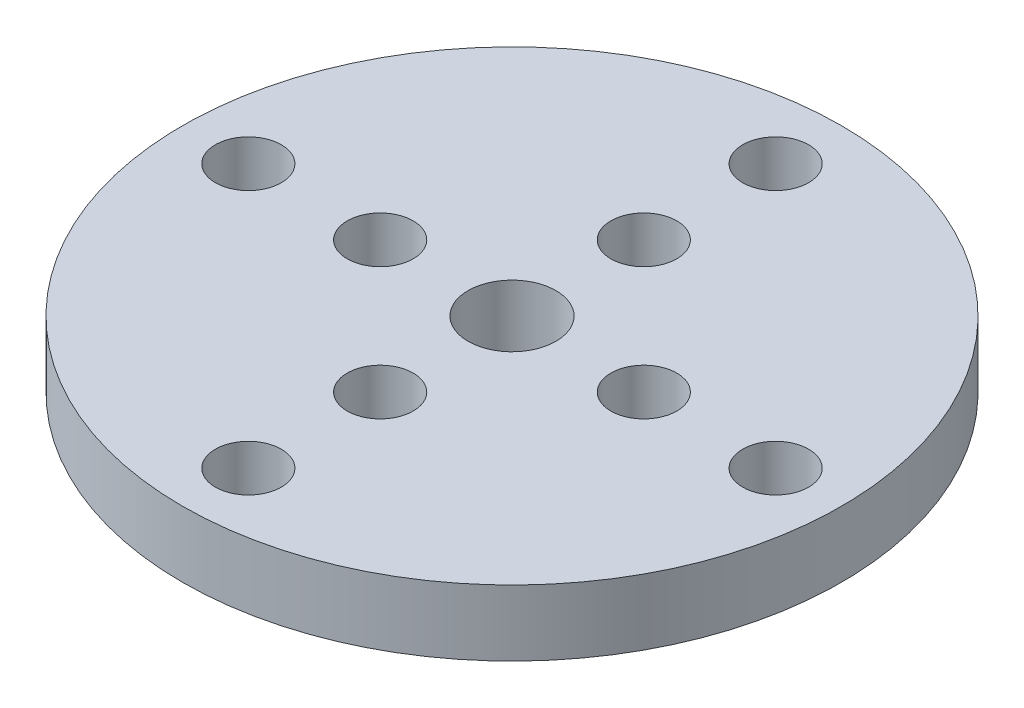
ISO-10303-21;
HEADER;
FILE_DESCRIPTION(('STEP AP214'),'2;1');
FILE_NAME('part.step','',(''),(''),'','','');
FILE_SCHEMA(('AUTOMOTIVE_DESIGN { 1 0 10303 214 1 1 1 1 }'));
ENDSEC;
DATA;
#1=APPLICATION_CONTEXT('core data for automotive mechanical design processes');
#2=APPLICATION_PROTOCOL_DEFINITION('international standard','automotive_design',2000,#1);
#3=PRODUCT_CONTEXT('',#1,'mechanical');
#4=PRODUCT('Part','Part','',(#3));
#5=PRODUCT_RELATED_PRODUCT_CATEGORY('part','',(#4));
#6=PRODUCT_DEFINITION_FORMATION('','',#4);
#7=PRODUCT_DEFINITION_CONTEXT('part definition',#1,'design');
#8=PRODUCT_DEFINITION('design','',#6,#7);
#9=PRODUCT_DEFINITION_SHAPE('','',#8);
#10=(LENGTH_UNIT() NAMED_UNIT(*) SI_UNIT(.MILLI.,.METRE.));
#11=(NAMED_UNIT(*) PLANE_ANGLE_UNIT() SI_UNIT($,.RADIAN.));
#12=(NAMED_UNIT(*) SI_UNIT($,.STERADIAN.) SOLID_ANGLE_UNIT());
#13=UNCERTAINTY_MEASURE_WITH_UNIT(LENGTH_MEASURE(1.E-05),#10,'distance_accuracy_value','');
#14=(GEOMETRIC_REPRESENTATION_CONTEXT(3) GLOBAL_UNCERTAINTY_ASSIGNED_CONTEXT((#13)) GLOBAL_UNIT_ASSIGNED_CONTEXT((#10,
#11,#12)) REPRESENTATION_CONTEXT('',''));
#15=CARTESIAN_POINT('',(0.,0.,0.));
#16=DIRECTION('',(0.,0.,1.));
#17=DIRECTION('',(1.,0.,0.));
#18=AXIS2_PLACEMENT_3D('',#15,#16,#17);
#19=CARTESIAN_POINT('',(0.,3.,0.));
#20=DIRECTION('',(0.,1.,0.));
#21=DIRECTION('',(0.,0.,1.));
#22=AXIS2_PLACEMENT_3D('',#19,#20,#21);
#23=PLANE('',#22);
#24=CARTESIAN_POINT('',(5.18682319317065E-13,3.,12.0000000000005));
#25=DIRECTION('',(0.,1.,0.));
#26=DIRECTION('',(0.,0.,1.));
#27=AXIS2_PLACEMENT_3D('',#24,#25,#26);
#28=CIRCLE('',#27,1.5);
#29=CARTESIAN_POINT('',(5.18682319317065E-13,3.,13.5000000000005));
#30=VERTEX_POINT('',#29);
#31=EDGE_CURVE('E85',#30,#30,#28,.T.);
#32=ORIENTED_EDGE('',*,*,#31,.F.);
#33=EDGE_LOOP('',(#32));
#34=FACE_BOUND('',#33,.T.);
#35=CARTESIAN_POINT('',(0.,3.,-12.));
#36=DIRECTION('',(0.,1.,0.));
#37=DIRECTION('',(0.,0.,1.));
#38=AXIS2_PLACEMENT_3D('',#35,#36,#37);
#39=CIRCLE('',#38,1.5);
#40=CARTESIAN_POINT('',(0.,3.,-10.5));
#41=VERTEX_POINT('',#40);
#42=EDGE_CURVE('E73',#41,#41,#39,.T.);
#43=ORIENTED_EDGE('',*,*,#42,.F.);
#44=EDGE_LOOP('',(#43));
#45=FACE_BOUND('',#44,.T.);
#46=CARTESIAN_POINT('',(5.04363013659562E-13,3.,6.0000000000005));
#47=DIRECTION('',(0.,1.,0.));
#48=DIRECTION('',(0.,0.,1.));
#49=AXIS2_PLACEMENT_3D('',#46,#47,#48);
#50=CIRCLE('',#49,1.50000000000015);
#51=CARTESIAN_POINT('',(5.04363013659562E-13,3.,7.50000000000066));
#52=VERTEX_POINT('',#51);
#53=EDGE_CURVE('E61',#52,#52,#50,.T.);
#54=ORIENTED_EDGE('',*,*,#53,.F.);
#55=EDGE_LOOP('',(#54));
#56=FACE_BOUND('',#55,.T.);
#57=CARTESIAN_POINT('',(0.,3.,-6.));
#58=DIRECTION('',(0.,1.,0.));
#59=DIRECTION('',(0.,0.,1.));
#60=AXIS2_PLACEMENT_3D('',#57,#58,#59);
#61=CIRCLE('',#60,1.5);
#62=CARTESIAN_POINT('',(0.,3.,-4.5));
#63=VERTEX_POINT('',#62);
#64=EDGE_CURVE('E49',#63,#63,#61,.T.);
#65=ORIENTED_EDGE('',*,*,#64,.F.);
#66=EDGE_LOOP('',(#65));
#67=FACE_BOUND('',#66,.T.);
#68=CARTESIAN_POINT('',(0.,3.,0.));
#69=DIRECTION('',(0.,1.,0.));
#70=DIRECTION('',(0.,0.,1.));
#71=AXIS2_PLACEMENT_3D('',#68,#69,#70);
#72=CIRCLE('',#71,15.);
#73=CARTESIAN_POINT('',(0.,3.,15.));
#74=VERTEX_POINT('',#73);
#75=EDGE_CURVE('E10',#74,#74,#72,.T.);
#76=ORIENTED_EDGE('',*,*,#75,.T.);
#77=EDGE_LOOP('',(#76));
#78=FACE_BOUND('',#77,.T.);
#79=CARTESIAN_POINT('',(0.,3.,0.));
#80=DIRECTION('',(0.,1.,0.));
#81=DIRECTION('',(0.,0.,1.));
#82=AXIS2_PLACEMENT_3D('',#79,#80,#81);
#83=CIRCLE('',#82,2.);
#84=CARTESIAN_POINT('',(0.,3.,2.));
#85=VERTEX_POINT('',#84);
#86=EDGE_CURVE('E44',#85,#85,#83,.T.);
#87=ORIENTED_EDGE('',*,*,#86,.F.);
#88=EDGE_LOOP('',(#87));
#89=FACE_BOUND('',#88,.T.);
#90=CARTESIAN_POINT('',(6.00000000000051,3.,0.));
#91=DIRECTION('',(0.,1.,0.));
#92=DIRECTION('',(0.,0.,1.));
#93=AXIS2_PLACEMENT_3D('',#90,#91,#92);
#94=CIRCLE('',#93,1.49999999999983);
#95=CARTESIAN_POINT('',(6.00000000000051,3.,1.49999999999983));
#96=VERTEX_POINT('',#95);
#97=EDGE_CURVE('E55',#96,#96,#94,.T.);
#98=ORIENTED_EDGE('',*,*,#97,.F.);
#99=EDGE_LOOP('',(#98));
#100=FACE_BOUND('',#99,.T.);
#101=CARTESIAN_POINT('',(-6.,3.,5.10814164635692E-13));
#102=DIRECTION('',(0.,1.,0.));
#103=DIRECTION('',(0.,0.,1.));
#104=AXIS2_PLACEMENT_3D('',#101,#102,#103);
#105=CIRCLE('',#104,1.50000000000032);
#106=CARTESIAN_POINT('',(-6.,3.,1.50000000000083));
#107=VERTEX_POINT('',#106);
#108=EDGE_CURVE('E67',#107,#107,#105,.T.);
#109=ORIENTED_EDGE('',*,*,#108,.F.);
#110=EDGE_LOOP('',(#109));
#111=FACE_BOUND('',#110,.T.);
#112=CARTESIAN_POINT('',(12.0000000000005,3.,0.));
#113=DIRECTION('',(0.,1.,0.));
#114=DIRECTION('',(0.,0.,1.));
#115=AXIS2_PLACEMENT_3D('',#112,#113,#114);
#116=CIRCLE('',#115,1.5);
#117=CARTESIAN_POINT('',(12.0000000000005,3.,1.49999999999995));
#118=VERTEX_POINT('',#117);
#119=EDGE_CURVE('E79',#118,#118,#116,.T.);
#120=ORIENTED_EDGE('',*,*,#119,.F.);
#121=EDGE_LOOP('',(#120));
#122=FACE_BOUND('',#121,.T.);
#123=CARTESIAN_POINT('',(-12.,3.,5.16947595841089E-13));
#124=DIRECTION('',(0.,1.,0.));
#125=DIRECTION('',(0.,0.,1.));
#126=AXIS2_PLACEMENT_3D('',#123,#124,#125);
#127=CIRCLE('',#126,1.5);
#128=CARTESIAN_POINT('',(-12.,3.,1.50000000000052));
#129=VERTEX_POINT('',#128);
#130=EDGE_CURVE('E91',#129,#129,#127,.T.);
#131=ORIENTED_EDGE('',*,*,#130,.F.);
#132=EDGE_LOOP('',(#131));
#133=FACE_BOUND('',#132,.T.);
#134=ADVANCED_FACE('F33',(#34,#45,#56,#67,#78,#89,#100,#111,#122,#133),#23,.T.);
#135=CARTESIAN_POINT('',(0.,0.,0.));
#136=DIRECTION('',(0.,1.,0.));
#137=DIRECTION('',(0.,0.,1.));
#138=AXIS2_PLACEMENT_3D('',#135,#136,#137);
#139=PLANE('',#138);
#140=CARTESIAN_POINT('',(0.,0.,0.));
#141=DIRECTION('',(0.,1.,0.));
#142=DIRECTION('',(0.,0.,1.));
#143=AXIS2_PLACEMENT_3D('',#140,#141,#142);
#144=CIRCLE('',#143,15.);
#145=CARTESIAN_POINT('',(0.,0.,15.));
#146=VERTEX_POINT('',#145);
#147=EDGE_CURVE('E37',#146,#146,#144,.T.);
#148=ORIENTED_EDGE('',*,*,#147,.F.);
#149=EDGE_LOOP('',(#148));
#150=FACE_BOUND('',#149,.T.);
#151=CARTESIAN_POINT('',(0.,0.,0.));
#152=DIRECTION('',(0.,1.,0.));
#153=DIRECTION('',(0.,0.,1.));
#154=AXIS2_PLACEMENT_3D('',#151,#152,#153);
#155=CIRCLE('',#154,2.);
#156=CARTESIAN_POINT('',(0.,0.,2.));
#157=VERTEX_POINT('',#156);
#158=EDGE_CURVE('E46',#157,#157,#155,.T.);
#159=ORIENTED_EDGE('',*,*,#158,.T.);
#160=EDGE_LOOP('',(#159));
#161=FACE_BOUND('',#160,.T.);
#162=CARTESIAN_POINT('',(0.,0.,-6.));
#163=DIRECTION('',(0.,1.,0.));
#164=DIRECTION('',(0.,0.,1.));
#165=AXIS2_PLACEMENT_3D('',#162,#163,#164);
#166=CIRCLE('',#165,1.5);
#167=CARTESIAN_POINT('',(0.,0.,-4.5));
#168=VERTEX_POINT('',#167);
#169=EDGE_CURVE('E52',#168,#168,#166,.T.);
#170=ORIENTED_EDGE('',*,*,#169,.T.);
#171=EDGE_LOOP('',(#170));
#172=FACE_BOUND('',#171,.T.);
#173=CARTESIAN_POINT('',(6.00000000000051,0.,0.));
#174=DIRECTION('',(0.,1.,0.));
#175=DIRECTION('',(0.,0.,1.));
#176=AXIS2_PLACEMENT_3D('',#173,#174,#175);
#177=CIRCLE('',#176,1.49999999999983);
#178=CARTESIAN_POINT('',(6.00000000000051,0.,1.49999999999983));
#179=VERTEX_POINT('',#178);
#180=EDGE_CURVE('E58',#179,#179,#177,.T.);
#181=ORIENTED_EDGE('',*,*,#180,.T.);
#182=EDGE_LOOP('',(#181));
#183=FACE_BOUND('',#182,.T.);
#184=CARTESIAN_POINT('',(5.04363013659562E-13,0.,6.0000000000005));
#185=DIRECTION('',(0.,1.,0.));
#186=DIRECTION('',(0.,0.,1.));
#187=AXIS2_PLACEMENT_3D('',#184,#185,#186);
#188=CIRCLE('',#187,1.50000000000015);
#189=CARTESIAN_POINT('',(5.04363013659562E-13,0.,7.50000000000066));
#190=VERTEX_POINT('',#189);
#191=EDGE_CURVE('E64',#190,#190,#188,.T.);
#192=ORIENTED_EDGE('',*,*,#191,.T.);
#193=EDGE_LOOP('',(#192));
#194=FACE_BOUND('',#193,.T.);
#195=CARTESIAN_POINT('',(-6.,0.,5.10814164635692E-13));
#196=DIRECTION('',(0.,1.,0.));
#197=DIRECTION('',(0.,0.,1.));
#198=AXIS2_PLACEMENT_3D('',#195,#196,#197);
#199=CIRCLE('',#198,1.50000000000032);
#200=CARTESIAN_POINT('',(-6.,0.,1.50000000000083));
#201=VERTEX_POINT('',#200);
#202=EDGE_CURVE('E70',#201,#201,#199,.T.);
#203=ORIENTED_EDGE('',*,*,#202,.T.);
#204=EDGE_LOOP('',(#203));
#205=FACE_BOUND('',#204,.T.);
#206=CARTESIAN_POINT('',(0.,0.,-12.));
#207=DIRECTION('',(0.,1.,0.));
#208=DIRECTION('',(0.,0.,1.));
#209=AXIS2_PLACEMENT_3D('',#206,#207,#208);
#210=CIRCLE('',#209,1.5);
#211=CARTESIAN_POINT('',(0.,0.,-10.5));
#212=VERTEX_POINT('',#211);
#213=EDGE_CURVE('E76',#212,#212,#210,.T.);
#214=ORIENTED_EDGE('',*,*,#213,.T.);
#215=EDGE_LOOP('',(#214));
#216=FACE_BOUND('',#215,.T.);
#217=CARTESIAN_POINT('',(12.0000000000005,0.,0.));
#218=DIRECTION('',(0.,1.,0.));
#219=DIRECTION('',(0.,0.,1.));
#220=AXIS2_PLACEMENT_3D('',#217,#218,#219);
#221=CIRCLE('',#220,1.5);
#222=CARTESIAN_POINT('',(12.0000000000005,0.,1.49999999999995));
#223=VERTEX_POINT('',#222);
#224=EDGE_CURVE('E82',#223,#223,#221,.T.);
#225=ORIENTED_EDGE('',*,*,#224,.T.);
#226=EDGE_LOOP('',(#225));
#227=FACE_BOUND('',#226,.T.);
#228=CARTESIAN_POINT('',(5.18682319317065E-13,0.,12.0000000000005));
#229=DIRECTION('',(0.,1.,0.));
#230=DIRECTION('',(0.,0.,1.));
#231=AXIS2_PLACEMENT_3D('',#228,#229,#230);
#232=CIRCLE('',#231,1.5);
#233=CARTESIAN_POINT('',(5.18682319317065E-13,0.,13.5000000000005));
#234=VERTEX_POINT('',#233);
#235=EDGE_CURVE('E88',#234,#234,#232,.T.);
#236=ORIENTED_EDGE('',*,*,#235,.T.);
#237=EDGE_LOOP('',(#236));
#238=FACE_BOUND('',#237,.T.);
#239=CARTESIAN_POINT('',(-12.,0.,5.16947595841089E-13));
#240=DIRECTION('',(0.,1.,0.));
#241=DIRECTION('',(0.,0.,1.));
#242=AXIS2_PLACEMENT_3D('',#239,#240,#241);
#243=CIRCLE('',#242,1.5);
#244=CARTESIAN_POINT('',(-12.,0.,1.50000000000052));
#245=VERTEX_POINT('',#244);
#246=EDGE_CURVE('E94',#245,#245,#243,.T.);
#247=ORIENTED_EDGE('',*,*,#246,.T.);
#248=EDGE_LOOP('',(#247));
#249=FACE_BOUND('',#248,.T.);
#250=ADVANCED_FACE('F104',(#150,#161,#172,#183,#194,#205,#216,#227,#238,#249),#139,.F.);
#251=CARTESIAN_POINT('',(0.,3.,0.));
#252=DIRECTION('',(0.,-1.,0.));
#253=DIRECTION('',(0.,0.,-1.));
#254=AXIS2_PLACEMENT_3D('',#251,#252,#253);
#255=CYLINDRICAL_SURFACE('',#254,15.);
#256=ORIENTED_EDGE('',*,*,#75,.F.);
#257=EDGE_LOOP('',(#256));
#258=FACE_BOUND('',#257,.T.);
#259=ORIENTED_EDGE('',*,*,#147,.T.);
#260=EDGE_LOOP('',(#259));
#261=FACE_BOUND('',#260,.T.);
#262=ADVANCED_FACE('F35',(#258,#261),#255,.T.);
#263=CARTESIAN_POINT('',(0.,3.,0.));
#264=DIRECTION('',(0.,-1.,0.));
#265=DIRECTION('',(0.,0.,-1.));
#266=AXIS2_PLACEMENT_3D('',#263,#264,#265);
#267=CYLINDRICAL_SURFACE('',#266,2.);
#268=ORIENTED_EDGE('',*,*,#86,.T.);
#269=EDGE_LOOP('',(#268));
#270=FACE_BOUND('',#269,.T.);
#271=ORIENTED_EDGE('',*,*,#158,.F.);
#272=EDGE_LOOP('',(#271));
#273=FACE_BOUND('',#272,.T.);
#274=ADVANCED_FACE('F114',(#270,#273),#267,.F.);
#275=CARTESIAN_POINT('',(0.,3.,-6.));
#276=DIRECTION('',(0.,-1.,0.));
#277=DIRECTION('',(0.,0.,-1.));
#278=AXIS2_PLACEMENT_3D('',#275,#276,#277);
#279=CYLINDRICAL_SURFACE('',#278,1.5);
#280=ORIENTED_EDGE('',*,*,#64,.T.);
#281=EDGE_LOOP('',(#280));
#282=FACE_BOUND('',#281,.T.);
#283=ORIENTED_EDGE('',*,*,#169,.F.);
#284=EDGE_LOOP('',(#283));
#285=FACE_BOUND('',#284,.T.);
#286=ADVANCED_FACE('F117',(#282,#285),#279,.F.);
#287=CARTESIAN_POINT('',(6.00000000000051,3.,0.));
#288=DIRECTION('',(0.,-1.,0.));
#289=DIRECTION('',(0.,0.,-1.));
#290=AXIS2_PLACEMENT_3D('',#287,#288,#289);
#291=CYLINDRICAL_SURFACE('',#290,1.49999999999983);
#292=ORIENTED_EDGE('',*,*,#97,.T.);
#293=EDGE_LOOP('',(#292));
#294=FACE_BOUND('',#293,.T.);
#295=ORIENTED_EDGE('',*,*,#180,.F.);
#296=EDGE_LOOP('',(#295));
#297=FACE_BOUND('',#296,.T.);
#298=ADVANCED_FACE('F121',(#294,#297),#291,.F.);
#299=CARTESIAN_POINT('',(5.04363013659562E-13,3.,6.0000000000005));
#300=DIRECTION('',(0.,-1.,0.));
#301=DIRECTION('',(0.,0.,-1.));
#302=AXIS2_PLACEMENT_3D('',#299,#300,#301);
#303=CYLINDRICAL_SURFACE('',#302,1.50000000000015);
#304=ORIENTED_EDGE('',*,*,#53,.T.);
#305=EDGE_LOOP('',(#304));
#306=FACE_BOUND('',#305,.T.);
#307=ORIENTED_EDGE('',*,*,#191,.F.);
#308=EDGE_LOOP('',(#307));
#309=FACE_BOUND('',#308,.T.);
#310=ADVANCED_FACE('F125',(#306,#309),#303,.F.);
#311=CARTESIAN_POINT('',(-6.,3.,5.10814164635692E-13));
#312=DIRECTION('',(0.,-1.,0.));
#313=DIRECTION('',(0.,0.,-1.));
#314=AXIS2_PLACEMENT_3D('',#311,#312,#313);
#315=CYLINDRICAL_SURFACE('',#314,1.50000000000032);
#316=ORIENTED_EDGE('',*,*,#108,.T.);
#317=EDGE_LOOP('',(#316));
#318=FACE_BOUND('',#317,.T.);
#319=ORIENTED_EDGE('',*,*,#202,.F.);
#320=EDGE_LOOP('',(#319));
#321=FACE_BOUND('',#320,.T.);
#322=ADVANCED_FACE('F129',(#318,#321),#315,.F.);
#323=CARTESIAN_POINT('',(0.,3.,-12.));
#324=DIRECTION('',(0.,-1.,0.));
#325=DIRECTION('',(0.,0.,-1.));
#326=AXIS2_PLACEMENT_3D('',#323,#324,#325);
#327=CYLINDRICAL_SURFACE('',#326,1.5);
#328=ORIENTED_EDGE('',*,*,#42,.T.);
#329=EDGE_LOOP('',(#328));
#330=FACE_BOUND('',#329,.T.);
#331=ORIENTED_EDGE('',*,*,#213,.F.);
#332=EDGE_LOOP('',(#331));
#333=FACE_BOUND('',#332,.T.);
#334=ADVANCED_FACE('F133',(#330,#333),#327,.F.);
#335=CARTESIAN_POINT('',(12.0000000000005,3.,0.));
#336=DIRECTION('',(0.,-1.,0.));
#337=DIRECTION('',(0.,0.,-1.));
#338=AXIS2_PLACEMENT_3D('',#335,#336,#337);
#339=CYLINDRICAL_SURFACE('',#338,1.5);
#340=ORIENTED_EDGE('',*,*,#119,.T.);
#341=EDGE_LOOP('',(#340));
#342=FACE_BOUND('',#341,.T.);
#343=ORIENTED_EDGE('',*,*,#224,.F.);
#344=EDGE_LOOP('',(#343));
#345=FACE_BOUND('',#344,.T.);
#346=ADVANCED_FACE('F137',(#342,#345),#339,.F.);
#347=CARTESIAN_POINT('',(5.18682319317065E-13,3.,12.0000000000005));
#348=DIRECTION('',(0.,-1.,0.));
#349=DIRECTION('',(0.,0.,-1.));
#350=AXIS2_PLACEMENT_3D('',#347,#348,#349);
#351=CYLINDRICAL_SURFACE('',#350,1.5);
#352=ORIENTED_EDGE('',*,*,#31,.T.);
#353=EDGE_LOOP('',(#352));
#354=FACE_BOUND('',#353,.T.);
#355=ORIENTED_EDGE('',*,*,#235,.F.);
#356=EDGE_LOOP('',(#355));
#357=FACE_BOUND('',#356,.T.);
#358=ADVANCED_FACE('F141',(#354,#357),#351,.F.);
#359=CARTESIAN_POINT('',(-12.,3.,5.16947595841089E-13));
#360=DIRECTION('',(0.,-1.,0.));
#361=DIRECTION('',(0.,0.,-1.));
#362=AXIS2_PLACEMENT_3D('',#359,#360,#361);
#363=CYLINDRICAL_SURFACE('',#362,1.5);
#364=ORIENTED_EDGE('',*,*,#130,.T.);
#365=EDGE_LOOP('',(#364));
#366=FACE_BOUND('',#365,.T.);
#367=ORIENTED_EDGE('',*,*,#246,.F.);
#368=EDGE_LOOP('',(#367));
#369=FACE_BOUND('',#368,.T.);
#370=ADVANCED_FACE('F100',(#366,#369),#363,.F.);
#371=CLOSED_SHELL('',(#134,#250,#262,#274,#286,#298,#310,#322,#334,#346,#358,#370));
#372=MANIFOLD_SOLID_BREP('B2',#371);
#373=ADVANCED_BREP_SHAPE_REPRESENTATION('',(#18,#372),#14);
#374=SHAPE_DEFINITION_REPRESENTATION(#9,#373);
ENDSEC;
END-ISO-10303-21;
